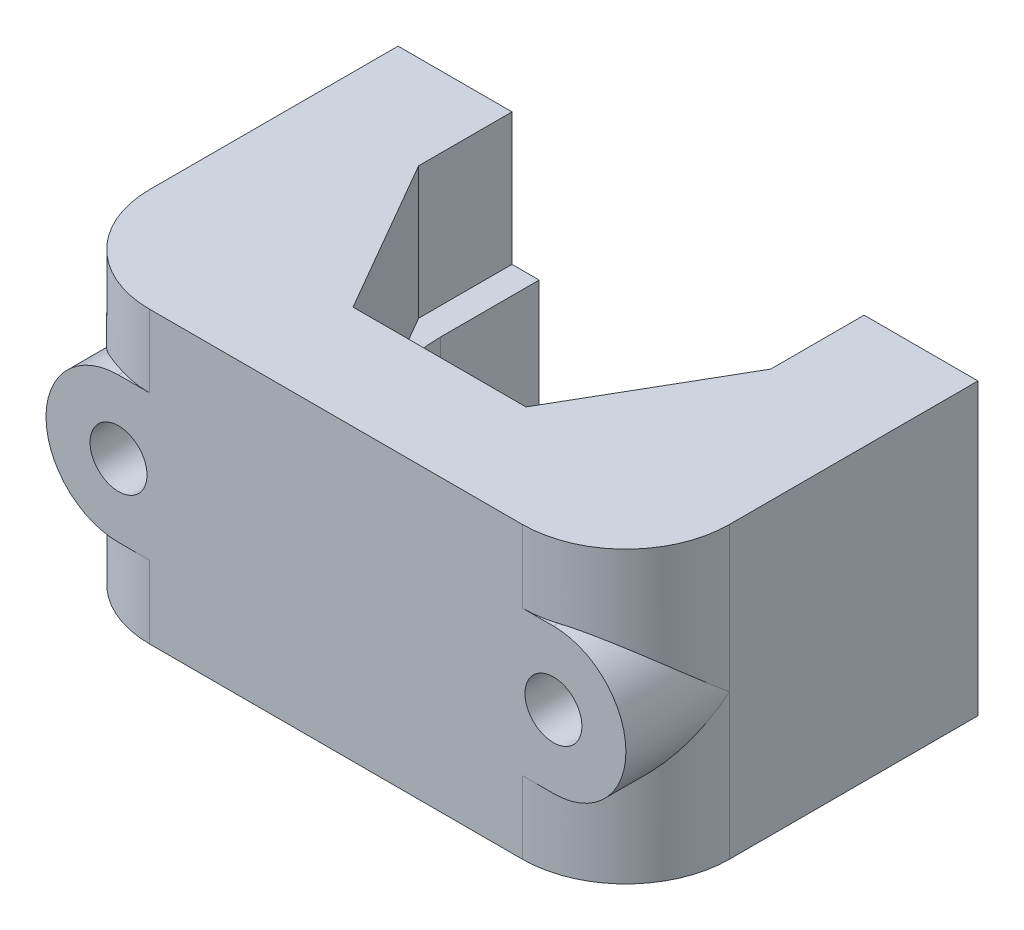
ISO-10303-21;
HEADER;
FILE_DESCRIPTION(('STEP AP214'),'2;1');
FILE_NAME('part.step','',(''),(''),'','','');
FILE_SCHEMA(('AUTOMOTIVE_DESIGN { 1 0 10303 214 1 1 1 1 }'));
ENDSEC;
DATA;
#1=APPLICATION_CONTEXT('core data for automotive mechanical design processes');
#2=APPLICATION_PROTOCOL_DEFINITION('international standard','automotive_design',2000,#1);
#3=PRODUCT_CONTEXT('',#1,'mechanical');
#4=PRODUCT('Part','Part','',(#3));
#5=PRODUCT_RELATED_PRODUCT_CATEGORY('part','',(#4));
#6=PRODUCT_DEFINITION_FORMATION('','',#4);
#7=PRODUCT_DEFINITION_CONTEXT('part definition',#1,'design');
#8=PRODUCT_DEFINITION('design','',#6,#7);
#9=PRODUCT_DEFINITION_SHAPE('','',#8);
#10=(LENGTH_UNIT() NAMED_UNIT(*) SI_UNIT(.MILLI.,.METRE.));
#11=(NAMED_UNIT(*) PLANE_ANGLE_UNIT() SI_UNIT($,.RADIAN.));
#12=(NAMED_UNIT(*) SI_UNIT($,.STERADIAN.) SOLID_ANGLE_UNIT());
#13=UNCERTAINTY_MEASURE_WITH_UNIT(LENGTH_MEASURE(1.E-05),#10,'distance_accuracy_value','');
#14=(GEOMETRIC_REPRESENTATION_CONTEXT(3) GLOBAL_UNCERTAINTY_ASSIGNED_CONTEXT((#13)) GLOBAL_UNIT_ASSIGNED_CONTEXT((#10,
#11,#12)) REPRESENTATION_CONTEXT('',''));
#15=CARTESIAN_POINT('',(0.,0.,0.));
#16=DIRECTION('',(0.,0.,1.));
#17=DIRECTION('',(1.,0.,0.));
#18=AXIS2_PLACEMENT_3D('',#15,#16,#17);
#19=CARTESIAN_POINT('',(18.,28.,7.));
#20=DIRECTION('',(0.,-1.,0.));
#21=DIRECTION('',(0.,0.,-1.));
#22=AXIS2_PLACEMENT_3D('',#19,#20,#21);
#23=CYLINDRICAL_SURFACE('',#22,10.);
#24=CARTESIAN_POINT('',(18.,7.,7.));
#25=DIRECTION('',(0.,-1.,0.));
#26=DIRECTION('',(1.,0.,0.));
#27=AXIS2_PLACEMENT_3D('',#24,#25,#26);
#28=CIRCLE('',#27,10.);
#29=CARTESIAN_POINT('',(18.,7.,17.));
#30=VERTEX_POINT('',#29);
#31=CARTESIAN_POINT('',(21.,7.,16.5393920141695));
#32=VERTEX_POINT('',#31);
#33=EDGE_CURVE('E11',#30,#32,#28,.F.);
#34=ORIENTED_EDGE('',*,*,#33,.F.);
#35=DIRECTION('',(0.,-1.,0.));
#36=VECTOR('',#35,1.);
#37=CARTESIAN_POINT('',(18.,28.,17.));
#38=LINE('',#37,#36);
#39=CARTESIAN_POINT('',(18.,0.,17.));
#40=VERTEX_POINT('',#39);
#41=EDGE_CURVE('E336',#40,#30,#38,.F.);
#42=ORIENTED_EDGE('',*,*,#41,.F.);
#43=CARTESIAN_POINT('',(18.,0.,7.));
#44=DIRECTION('',(0.,-1.,0.));
#45=DIRECTION('',(0.,0.,-1.));
#46=AXIS2_PLACEMENT_3D('',#43,#44,#45);
#47=CIRCLE('',#46,10.);
#48=CARTESIAN_POINT('',(28.,0.,7.));
#49=VERTEX_POINT('',#48);
#50=EDGE_CURVE('E329',#49,#40,#47,.T.);
#51=ORIENTED_EDGE('',*,*,#50,.F.);
#52=DIRECTION('',(0.,-1.,0.));
#53=VECTOR('',#52,1.);
#54=CARTESIAN_POINT('',(28.,28.,7.));
#55=LINE('',#54,#53);
#56=CARTESIAN_POINT('',(28.,14.,7.));
#57=VERTEX_POINT('',#56);
#58=EDGE_CURVE('E323',#57,#49,#55,.T.);
#59=ORIENTED_EDGE('',*,*,#58,.F.);
#60=CARTESIAN_POINT('',(18.,7.67544467966324,17.));
#61=CARTESIAN_POINT('',(18.151591670897,7.60350463316133,17.0000275659047));
#62=CARTESIAN_POINT('',(18.3058134289684,7.53706094359077,16.9965539811801));
#63=CARTESIAN_POINT('',(18.6183277419677,7.41550033736447,16.982083687537));
#64=CARTESIAN_POINT('',(18.7766206650396,7.36038444913038,16.9710862959435));
#65=CARTESIAN_POINT('',(19.0955114974498,7.26199591021074,16.9410989491163));
#66=CARTESIAN_POINT('',(19.2560996246948,7.21868323937458,16.9221365703262));
#67=CARTESIAN_POINT('',(19.5787962164307,7.14379075090905,16.8759281223142));
#68=CARTESIAN_POINT('',(19.7409045388676,7.11220984799179,16.8486828197571));
#69=CARTESIAN_POINT('',(20.0655355259705,7.06070460024447,16.7857515768893));
#70=CARTESIAN_POINT('',(20.2280584539619,7.0407940998188,16.7500556819373));
#71=CARTESIAN_POINT('',(20.5520552788346,7.01245439683495,16.6703076695015));
#72=CARTESIAN_POINT('',(20.7135291056568,7.00402595336219,16.6262549997657));
#73=CARTESIAN_POINT('',(21.0342322989839,6.99824652781946,16.530029578288));
#74=CARTESIAN_POINT('',(21.1934616306042,7.00089571773075,16.4778567004913));
#75=CARTESIAN_POINT('',(21.5086223174119,7.01671971702876,16.3657647867368));
#76=CARTESIAN_POINT('',(21.6645536346693,7.02989464740265,16.3058456617472));
#77=CARTESIAN_POINT('',(21.9746984827905,7.06640589951094,16.1777101072773));
#78=CARTESIAN_POINT('',(22.1288447583472,7.08990121615074,16.1093764007993));
#79=CARTESIAN_POINT('',(22.4321039391893,7.14632234754203,15.9657489772278));
#80=CARTESIAN_POINT('',(22.5812150162124,7.1792515474053,15.890452768395));
#81=CARTESIAN_POINT('',(23.0201926323534,7.29105655533448,15.6549264804796));
#82=CARTESIAN_POINT('',(23.3017312051195,7.38295326749079,15.4850472118168));
#83=CARTESIAN_POINT('',(23.7728408138076,7.56891616067594,15.1690837991766));
#84=CARTESIAN_POINT('',(23.967971102265,7.6568598371597,15.0274613032776));
#85=CARTESIAN_POINT('',(24.3435200983199,7.84653747255893,14.7341117265996));
#86=CARTESIAN_POINT('',(24.5239329308558,7.94827689587169,14.5823806540608));
#87=CARTESIAN_POINT('',(24.8701182050998,8.16357741193527,14.2702081587616));
#88=CARTESIAN_POINT('',(25.0358649155686,8.27715854902385,14.1097521944772));
#89=CARTESIAN_POINT('',(25.3525542617819,8.51416518188523,13.7817341758596));
#90=CARTESIAN_POINT('',(25.5034968157868,8.63759073200611,13.6141720822981));
#91=CARTESIAN_POINT('',(25.8473751281613,8.94286500335221,13.2060623467399));
#92=CARTESIAN_POINT('',(26.0335191032786,9.12862004414769,12.9626975378819));
#93=CARTESIAN_POINT('',(26.3787930189989,9.51276059785996,12.4669136033241));
#94=CARTESIAN_POINT('',(26.5379120053906,9.71115118783701,12.2144908560885));
#95=CARTESIAN_POINT('',(26.8303365332226,10.1179905201692,11.702360599615));
#96=CARTESIAN_POINT('',(26.9636109450841,10.3264510189371,11.4426447314515));
#97=CARTESIAN_POINT('',(27.2050769826474,10.7509025133519,10.9179042328043));
#98=CARTESIAN_POINT('',(27.3132719926699,10.9668924884087,10.65288032386));
#99=CARTESIAN_POINT('',(27.5085829875087,11.4117113933119,10.1100967537544));
#100=CARTESIAN_POINT('',(27.5948976372845,11.6407293639308,9.83220343060461));
#101=CARTESIAN_POINT('',(27.7424370656255,12.1030395527597,9.2734294004811));
#102=CARTESIAN_POINT('',(27.8036577953,12.3363324543885,8.99254821891298));
#103=CARTESIAN_POINT('',(27.9502499186836,13.0393865601193,8.14816027008462));
#104=CARTESIAN_POINT('',(27.9991205078775,13.5136528743621,7.5812960655684));
#105=CARTESIAN_POINT('',(27.9999960748293,13.9914442111166,7.01022612498551));
#106=CARTESIAN_POINT('',(27.9999999962139,13.9957221387849,7.00511302347019));
#107=CARTESIAN_POINT('',(28.,14.,6.99999999999999));
#108=B_SPLINE_CURVE_WITH_KNOTS('',3,(#60,#61,#62,#63,#64,#65,#66,#67,#68,#69,#70,#71,#72,#73,
#74,#75,#76,#77,#78,#79,#80,#81,#82,#83,#84,#85,#86,#87,#88,#89,#90,#91,#92,#93,#94,#95,#96,#97,
#98,#99,#100,#101,#102,#103,#104,#105,#106,#107),.UNSPECIFIED.,.F.,.F.,(4,2,2,2,2,2,2,2,2,2,2,2,
2,2,2,2,2,2,2,2,2,2,2,4),(0.,0.503271269304962,1.00658820913766,1.50817674020264,
2.00971885851898,2.51185475002133,3.01402383640688,3.51620071904199,4.01838337398713,
4.52858988832062,5.03897970722538,6.05966971402223,6.82867623977674,7.59798825818142,
8.3686243015096,9.13926459958357,10.2125873454532,11.2863441151418,12.3613862904773,
13.4362833105044,14.546190391155,15.6562764842976,17.8699961332932,17.8899961367534),.UNSPECIFIED.);
#109=EDGE_CURVE('E41',#32,#57,#108,.T.);
#110=ORIENTED_EDGE('',*,*,#109,.F.);
#111=EDGE_LOOP('',(#34,#42,#51,#59,#110));
#112=FACE_BOUND('',#111,.T.);
#113=ADVANCED_FACE('F32',(#112),#23,.T.);
#114=CARTESIAN_POINT('',(-18.,28.,7.));
#115=DIRECTION('',(0.,-1.,0.));
#116=DIRECTION('',(0.,0.,-1.));
#117=AXIS2_PLACEMENT_3D('',#114,#115,#116);
#118=CYLINDRICAL_SURFACE('',#117,10.);
#119=CARTESIAN_POINT('',(-18.,21.,7.));
#120=DIRECTION('',(0.,1.,0.));
#121=DIRECTION('',(-1.,0.,0.));
#122=AXIS2_PLACEMENT_3D('',#119,#120,#121);
#123=CIRCLE('',#122,10.);
#124=CARTESIAN_POINT('',(-18.,21.,17.));
#125=VERTEX_POINT('',#124);
#126=CARTESIAN_POINT('',(-21.,21.,16.5393920141695));
#127=VERTEX_POINT('',#126);
#128=EDGE_CURVE('E492',#125,#127,#123,.F.);
#129=ORIENTED_EDGE('',*,*,#128,.F.);
#130=DIRECTION('',(0.,-1.,0.));
#131=VECTOR('',#130,1.);
#132=CARTESIAN_POINT('',(-18.,28.,17.));
#133=LINE('',#132,#131);
#134=CARTESIAN_POINT('',(-18.,28.,17.));
#135=VERTEX_POINT('',#134);
#136=EDGE_CURVE('E332',#135,#125,#133,.T.);
#137=ORIENTED_EDGE('',*,*,#136,.F.);
#138=CARTESIAN_POINT('',(-18.,28.,7.));
#139=DIRECTION('',(0.,-1.,0.));
#140=DIRECTION('',(0.,0.,-1.));
#141=AXIS2_PLACEMENT_3D('',#138,#139,#140);
#142=CIRCLE('',#141,10.);
#143=CARTESIAN_POINT('',(-28.,28.,7.));
#144=VERTEX_POINT('',#143);
#145=EDGE_CURVE('E338',#144,#135,#142,.F.);
#146=ORIENTED_EDGE('',*,*,#145,.F.);
#147=DIRECTION('',(0.,-1.,0.));
#148=VECTOR('',#147,1.);
#149=CARTESIAN_POINT('',(-28.,28.,7.));
#150=LINE('',#149,#148);
#151=CARTESIAN_POINT('',(-28.,14.,7.));
#152=VERTEX_POINT('',#151);
#153=EDGE_CURVE('E342',#152,#144,#150,.F.);
#154=ORIENTED_EDGE('',*,*,#153,.F.);
#155=CARTESIAN_POINT('',(-18.,20.3245553203368,17.));
#156=CARTESIAN_POINT('',(-18.151591670897,20.3964953668387,17.0000275659047));
#157=CARTESIAN_POINT('',(-18.3058134289684,20.4629390564092,16.9965539811801));
#158=CARTESIAN_POINT('',(-18.6183277419678,20.5844996626356,16.982083687537));
#159=CARTESIAN_POINT('',(-18.7766206650397,20.6396155508696,16.9710862959435));
#160=CARTESIAN_POINT('',(-19.0955114974499,20.7380040897893,16.9410989491163));
#161=CARTESIAN_POINT('',(-19.2560996246948,20.7813167606254,16.9221365703262));
#162=CARTESIAN_POINT('',(-19.5787962164307,20.856209249091,16.8759281223141));
#163=CARTESIAN_POINT('',(-19.7409045388677,20.8877901520082,16.8486828197571));
#164=CARTESIAN_POINT('',(-20.0655355259705,20.9392953997555,16.7857515768893));
#165=CARTESIAN_POINT('',(-20.2280584539619,20.9592059001812,16.7500556819373));
#166=CARTESIAN_POINT('',(-20.5520552788345,20.987545603165,16.6703076695015));
#167=CARTESIAN_POINT('',(-20.7135291056568,20.9959740466378,16.6262549997657));
#168=CARTESIAN_POINT('',(-21.0342322989838,21.0017534721805,16.530029578288));
#169=CARTESIAN_POINT('',(-21.1934616306042,20.9991042822693,16.4778567004913));
#170=CARTESIAN_POINT('',(-21.5086223174119,20.9832802829712,16.3657647867369));
#171=CARTESIAN_POINT('',(-21.6645536346693,20.9701053525974,16.3058456617472));
#172=CARTESIAN_POINT('',(-21.9746984827905,20.9335941004891,16.1777101072773));
#173=CARTESIAN_POINT('',(-22.1288447583472,20.9100987838493,16.1093764007993));
#174=CARTESIAN_POINT('',(-22.4321039391894,20.853677652458,15.9657489772278));
#175=CARTESIAN_POINT('',(-22.5812150162125,20.8207484525947,15.890452768395));
#176=CARTESIAN_POINT('',(-23.0201926323534,20.7089434446655,15.6549264804795));
#177=CARTESIAN_POINT('',(-23.3017312051195,20.6170467325092,15.4850472118168));
#178=CARTESIAN_POINT('',(-23.7728408138076,20.4310838393241,15.1690837991766));
#179=CARTESIAN_POINT('',(-23.967971102265,20.3431401628403,15.0274613032776));
#180=CARTESIAN_POINT('',(-24.3435200983197,20.1534625274411,14.7341117265997));
#181=CARTESIAN_POINT('',(-24.5239329308557,20.0517231041284,14.582380654061));
#182=CARTESIAN_POINT('',(-24.8701182050996,19.8364225880648,14.2702081587617));
#183=CARTESIAN_POINT('',(-25.0358649155685,19.7228414509763,14.1097521944773));
#184=CARTESIAN_POINT('',(-25.3525542617818,19.4858348181148,13.7817341758597));
#185=CARTESIAN_POINT('',(-25.5034968157867,19.3624092679939,13.6141720822981));
#186=CARTESIAN_POINT('',(-25.8473751281614,19.0571349966477,13.2060623467398));
#187=CARTESIAN_POINT('',(-26.0335191032787,18.8713799558522,12.9626975378817));
#188=CARTESIAN_POINT('',(-26.3787930189991,18.4872394021398,12.4669136033238));
#189=CARTESIAN_POINT('',(-26.5379120053909,18.2888488121627,12.214490856088));
#190=CARTESIAN_POINT('',(-26.8303365332228,17.8820094798304,11.7023605996146));
#191=CARTESIAN_POINT('',(-26.9636109450843,17.6735489810624,11.4426447314514));
#192=CARTESIAN_POINT('',(-27.2050769826475,17.2490974866482,10.917904232804));
#193=CARTESIAN_POINT('',(-27.3132719926699,17.0331075115919,10.6528803238594));
#194=CARTESIAN_POINT('',(-27.5085829875087,16.5882886066875,10.1100967537549));
#195=CARTESIAN_POINT('',(-27.5948976372845,16.3592706360667,9.83220343060675));
#196=CARTESIAN_POINT('',(-27.7424370656255,15.8969604472429,9.27342940047912));
#197=CARTESIAN_POINT('',(-27.8036577953,15.6636675456209,8.99254821890534));
#198=CARTESIAN_POINT('',(-27.9502499186835,14.9606134398621,8.14816027010043));
#199=CARTESIAN_POINT('',(-27.9991205078774,14.486347125536,7.58129606565374));
#200=CARTESIAN_POINT('',(-27.9999960748293,14.0085557888816,7.01022612498705));
#201=CARTESIAN_POINT('',(-27.9999999962139,14.0042778612142,7.00511302347097));
#202=CARTESIAN_POINT('',(-28.,14.,6.99999999999999));
#203=B_SPLINE_CURVE_WITH_KNOTS('',3,(#155,#156,#157,#158,#159,#160,#161,#162,#163,#164,#165,
#166,#167,#168,#169,#170,#171,#172,#173,#174,#175,#176,#177,#178,#179,#180,#181,#182,#183,#184,
#185,#186,#187,#188,#189,#190,#191,#192,#193,#194,#195,#196,#197,#198,#199,#200,#201,#202),
.UNSPECIFIED.,.F.,.F.,(4,2,2,2,2,2,2,2,2,2,2,2,2,2,2,2,2,2,2,2,2,2,2,4),(0.,0.503271269304999,
1.00658820913773,1.50817674020267,2.00971885851899,2.51185475002131,3.01402383640683,
3.51620071904196,4.01838337398713,4.52858988832067,5.03897970722547,6.05966971402223,
6.82867623977658,7.59798825818109,8.36862430150943,9.13926459958357,10.2125873454536,
11.2863441151426,12.3613862904776,13.4362833105044,14.546190391155,15.6562764842973,
17.8699961332932,17.8899961367534),.UNSPECIFIED.);
#204=EDGE_CURVE('E355',#127,#152,#203,.T.);
#205=ORIENTED_EDGE('',*,*,#204,.F.);
#206=EDGE_LOOP('',(#129,#137,#146,#154,#205));
#207=FACE_BOUND('',#206,.T.);
#208=ADVANCED_FACE('F471',(#207),#118,.T.);
#209=CARTESIAN_POINT('',(-28.,28.,-17.));
#210=DIRECTION('',(0.,0.,1.));
#211=DIRECTION('',(1.,0.,0.));
#212=AXIS2_PLACEMENT_3D('',#209,#210,#211);
#213=PLANE('',#212);
#214=CARTESIAN_POINT('',(21.,14.,-17.));
#215=DIRECTION('',(0.,0.,1.));
#216=DIRECTION('',(1.,0.,0.));
#217=AXIS2_PLACEMENT_3D('',#214,#215,#216);
#218=CIRCLE('',#217,2.75);
#219=CARTESIAN_POINT('',(23.75,14.,-17.));
#220=VERTEX_POINT('',#219);
#221=EDGE_CURVE('E538',#220,#220,#218,.F.);
#222=ORIENTED_EDGE('',*,*,#221,.F.);
#223=EDGE_LOOP('',(#222));
#224=FACE_BOUND('',#223,.T.);
#225=DIRECTION('',(-1.,0.,0.));
#226=VECTOR('',#225,1.);
#227=CARTESIAN_POINT('',(-28.,0.,-17.));
#228=LINE('',#227,#226);
#229=CARTESIAN_POINT('',(28.,0.,-17.));
#230=VERTEX_POINT('',#229);
#231=CARTESIAN_POINT('',(14.375,0.,-17.));
#232=VERTEX_POINT('',#231);
#233=EDGE_CURVE('E311',#230,#232,#228,.T.);
#234=ORIENTED_EDGE('',*,*,#233,.T.);
#235=DIRECTION('',(0.,1.,0.));
#236=VECTOR('',#235,1.);
#237=CARTESIAN_POINT('',(14.375,-37.3947083734369,-17.));
#238=LINE('',#237,#236);
#239=CARTESIAN_POINT('',(14.375,15.25,-17.));
#240=VERTEX_POINT('',#239);
#241=EDGE_CURVE('E232',#232,#240,#238,.T.);
#242=ORIENTED_EDGE('',*,*,#241,.T.);
#243=DIRECTION('',(-1.,0.,0.));
#244=VECTOR('',#243,1.);
#245=CARTESIAN_POINT('',(-17.,15.25,-17.));
#246=LINE('',#245,#244);
#247=CARTESIAN_POINT('',(17.,15.25,-17.));
#248=VERTEX_POINT('',#247);
#249=EDGE_CURVE('E266',#248,#240,#246,.T.);
#250=ORIENTED_EDGE('',*,*,#249,.F.);
#251=DIRECTION('',(0.,1.,0.));
#252=VECTOR('',#251,1.);
#253=CARTESIAN_POINT('',(17.,15.25,-17.));
#254=LINE('',#253,#252);
#255=CARTESIAN_POINT('',(17.,28.,-17.));
#256=VERTEX_POINT('',#255);
#257=EDGE_CURVE('E284',#248,#256,#254,.T.);
#258=ORIENTED_EDGE('',*,*,#257,.T.);
#259=DIRECTION('',(-1.,0.,0.));
#260=VECTOR('',#259,1.);
#261=CARTESIAN_POINT('',(-28.,28.,-17.));
#262=LINE('',#261,#260);
#263=CARTESIAN_POINT('',(28.,28.,-17.));
#264=VERTEX_POINT('',#263);
#265=EDGE_CURVE('E299',#264,#256,#262,.T.);
#266=ORIENTED_EDGE('',*,*,#265,.F.);
#267=DIRECTION('',(0.,-1.,0.));
#268=VECTOR('',#267,1.);
#269=CARTESIAN_POINT('',(28.,28.,-17.));
#270=LINE('',#269,#268);
#271=EDGE_CURVE('E320',#264,#230,#270,.T.);
#272=ORIENTED_EDGE('',*,*,#271,.T.);
#273=EDGE_LOOP('',(#234,#242,#250,#258,#266,#272));
#274=FACE_BOUND('',#273,.T.);
#275=ADVANCED_FACE('F435',(#224,#274),#213,.F.);
#276=CARTESIAN_POINT('',(28.,28.,17.));
#277=DIRECTION('',(-1.,0.,0.));
#278=DIRECTION('',(0.,0.,1.));
#279=AXIS2_PLACEMENT_3D('',#276,#277,#278);
#280=PLANE('',#279);
#281=DIRECTION('',(0.,0.,-1.));
#282=VECTOR('',#281,1.);
#283=CARTESIAN_POINT('',(28.,28.,17.));
#284=LINE('',#283,#282);
#285=CARTESIAN_POINT('',(28.,28.,7.));
#286=VERTEX_POINT('',#285);
#287=EDGE_CURVE('E295',#286,#264,#284,.T.);
#288=ORIENTED_EDGE('',*,*,#287,.F.);
#289=EDGE_CURVE('E324',#286,#57,#55,.T.);
#290=ORIENTED_EDGE('',*,*,#289,.T.);
#291=ORIENTED_EDGE('',*,*,#58,.T.);
#292=DIRECTION('',(0.,0.,-1.));
#293=VECTOR('',#292,1.);
#294=CARTESIAN_POINT('',(28.,0.,17.));
#295=LINE('',#294,#293);
#296=EDGE_CURVE('E283',#49,#230,#295,.T.);
#297=ORIENTED_EDGE('',*,*,#296,.T.);
#298=ORIENTED_EDGE('',*,*,#271,.F.);
#299=EDGE_LOOP('',(#288,#290,#291,#297,#298));
#300=FACE_BOUND('',#299,.T.);
#301=ADVANCED_FACE('F433',(#300),#280,.F.);
#302=CARTESIAN_POINT('',(-21.,14.,-17.));
#303=DIRECTION('',(0.,0.,1.));
#304=DIRECTION('',(1.,0.,0.));
#305=AXIS2_PLACEMENT_3D('',#302,#303,#304);
#306=CIRCLE('',#305,2.75);
#307=CARTESIAN_POINT('',(-18.25,14.,-17.));
#308=VERTEX_POINT('',#307);
#309=EDGE_CURVE('E202',#308,#308,#306,.F.);
#310=ORIENTED_EDGE('',*,*,#309,.F.);
#311=EDGE_LOOP('',(#310));
#312=FACE_BOUND('',#311,.T.);
#313=CARTESIAN_POINT('',(-14.375,15.25,-17.));
#314=VERTEX_POINT('',#313);
#315=CARTESIAN_POINT('',(-17.,15.25,-17.));
#316=VERTEX_POINT('',#315);
#317=EDGE_CURVE('E265',#314,#316,#246,.T.);
#318=ORIENTED_EDGE('',*,*,#317,.F.);
#319=DIRECTION('',(0.,1.,0.));
#320=VECTOR('',#319,1.);
#321=CARTESIAN_POINT('',(-14.375,-37.3947083734369,-17.));
#322=LINE('',#321,#320);
#323=CARTESIAN_POINT('',(-14.375,0.,-17.));
#324=VERTEX_POINT('',#323);
#325=EDGE_CURVE('E241',#324,#314,#322,.T.);
#326=ORIENTED_EDGE('',*,*,#325,.F.);
#327=CARTESIAN_POINT('',(-28.,0.,-17.));
#328=VERTEX_POINT('',#327);
#329=EDGE_CURVE('E310',#324,#328,#228,.T.);
#330=ORIENTED_EDGE('',*,*,#329,.T.);
#331=DIRECTION('',(0.,-1.,0.));
#332=VECTOR('',#331,1.);
#333=CARTESIAN_POINT('',(-28.,28.,-17.));
#334=LINE('',#333,#332);
#335=CARTESIAN_POINT('',(-28.,28.,-17.));
#336=VERTEX_POINT('',#335);
#337=EDGE_CURVE('E308',#336,#328,#334,.T.);
#338=ORIENTED_EDGE('',*,*,#337,.F.);
#339=CARTESIAN_POINT('',(-17.,28.,-17.));
#340=VERTEX_POINT('',#339);
#341=EDGE_CURVE('E297',#340,#336,#262,.T.);
#342=ORIENTED_EDGE('',*,*,#341,.F.);
#343=DIRECTION('',(0.,1.,0.));
#344=VECTOR('',#343,1.);
#345=CARTESIAN_POINT('',(-17.,15.25,-17.));
#346=LINE('',#345,#344);
#347=EDGE_CURVE('E281',#316,#340,#346,.T.);
#348=ORIENTED_EDGE('',*,*,#347,.F.);
#349=EDGE_LOOP('',(#318,#326,#330,#338,#342,#348));
#350=FACE_BOUND('',#349,.T.);
#351=ADVANCED_FACE('F429',(#312,#350),#213,.F.);
#352=CARTESIAN_POINT('',(-28.,28.,17.));
#353=DIRECTION('',(1.,0.,0.));
#354=DIRECTION('',(0.,0.,-1.));
#355=AXIS2_PLACEMENT_3D('',#352,#353,#354);
#356=PLANE('',#355);
#357=DIRECTION('',(0.,0.,1.));
#358=VECTOR('',#357,1.);
#359=CARTESIAN_POINT('',(-28.,0.,17.));
#360=LINE('',#359,#358);
#361=CARTESIAN_POINT('',(-28.,0.,7.));
#362=VERTEX_POINT('',#361);
#363=EDGE_CURVE('E314',#328,#362,#360,.T.);
#364=ORIENTED_EDGE('',*,*,#363,.T.);
#365=EDGE_CURVE('E343',#362,#152,#150,.F.);
#366=ORIENTED_EDGE('',*,*,#365,.T.);
#367=ORIENTED_EDGE('',*,*,#153,.T.);
#368=DIRECTION('',(0.,0.,1.));
#369=VECTOR('',#368,1.);
#370=CARTESIAN_POINT('',(-28.,28.,17.));
#371=LINE('',#370,#369);
#372=EDGE_CURVE('E302',#336,#144,#371,.T.);
#373=ORIENTED_EDGE('',*,*,#372,.F.);
#374=ORIENTED_EDGE('',*,*,#337,.T.);
#375=EDGE_LOOP('',(#364,#366,#367,#373,#374));
#376=FACE_BOUND('',#375,.T.);
#377=ADVANCED_FACE('F425',(#376),#356,.F.);
#378=CARTESIAN_POINT('',(-28.,28.,17.));
#379=DIRECTION('',(0.,0.,-1.));
#380=DIRECTION('',(-1.,0.,0.));
#381=AXIS2_PLACEMENT_3D('',#378,#379,#380);
#382=PLANE('',#381);
#383=CARTESIAN_POINT('',(-21.,14.,17.));
#384=DIRECTION('',(0.,0.,1.));
#385=DIRECTION('',(1.,0.,0.));
#386=AXIS2_PLACEMENT_3D('',#383,#384,#385);
#387=CIRCLE('',#386,2.75);
#388=CARTESIAN_POINT('',(-18.25,14.,17.));
#389=VERTEX_POINT('',#388);
#390=EDGE_CURVE('E539',#389,#389,#387,.T.);
#391=ORIENTED_EDGE('',*,*,#390,.F.);
#392=EDGE_LOOP('',(#391));
#393=FACE_BOUND('',#392,.T.);
#394=CARTESIAN_POINT('',(21.,14.,17.));
#395=DIRECTION('',(0.,0.,1.));
#396=DIRECTION('',(1.,0.,0.));
#397=AXIS2_PLACEMENT_3D('',#394,#395,#396);
#398=CIRCLE('',#397,2.75);
#399=CARTESIAN_POINT('',(23.75,14.,17.));
#400=VERTEX_POINT('',#399);
#401=EDGE_CURVE('E540',#400,#400,#398,.T.);
#402=ORIENTED_EDGE('',*,*,#401,.F.);
#403=EDGE_LOOP('',(#402));
#404=FACE_BOUND('',#403,.T.);
#405=DIRECTION('',(1.,0.,0.));
#406=VECTOR('',#405,1.);
#407=CARTESIAN_POINT('',(-28.,0.,17.));
#408=LINE('',#407,#406);
#409=CARTESIAN_POINT('',(-18.,0.,17.));
#410=VERTEX_POINT('',#409);
#411=EDGE_CURVE('E298',#410,#40,#408,.T.);
#412=ORIENTED_EDGE('',*,*,#411,.T.);
#413=ORIENTED_EDGE('',*,*,#41,.T.);
#414=DIRECTION('',(1.,0.,0.));
#415=VECTOR('',#414,1.);
#416=CARTESIAN_POINT('',(18.,7.,17.));
#417=LINE('',#416,#415);
#418=CARTESIAN_POINT('',(21.,7.,17.));
#419=VERTEX_POINT('',#418);
#420=EDGE_CURVE('E189',#30,#419,#417,.T.);
#421=ORIENTED_EDGE('',*,*,#420,.T.);
#422=CARTESIAN_POINT('',(21.,14.,17.));
#423=DIRECTION('',(0.,0.,-1.));
#424=DIRECTION('',(-1.,0.,0.));
#425=AXIS2_PLACEMENT_3D('',#422,#423,#424);
#426=CIRCLE('',#425,7.);
#427=CARTESIAN_POINT('',(21.,21.,17.));
#428=VERTEX_POINT('',#427);
#429=EDGE_CURVE('E184',#419,#428,#426,.F.);
#430=ORIENTED_EDGE('',*,*,#429,.T.);
#431=DIRECTION('',(-1.,0.,0.));
#432=VECTOR('',#431,1.);
#433=CARTESIAN_POINT('',(18.,21.,17.));
#434=LINE('',#433,#432);
#435=CARTESIAN_POINT('',(18.,21.,17.));
#436=VERTEX_POINT('',#435);
#437=EDGE_CURVE('E48',#428,#436,#434,.T.);
#438=ORIENTED_EDGE('',*,*,#437,.T.);
#439=CARTESIAN_POINT('',(18.,28.,17.));
#440=VERTEX_POINT('',#439);
#441=EDGE_CURVE('E335',#436,#440,#38,.F.);
#442=ORIENTED_EDGE('',*,*,#441,.T.);
#443=DIRECTION('',(1.,0.,0.));
#444=VECTOR('',#443,1.);
#445=CARTESIAN_POINT('',(-28.,28.,17.));
#446=LINE('',#445,#444);
#447=EDGE_CURVE('E305',#135,#440,#446,.T.);
#448=ORIENTED_EDGE('',*,*,#447,.F.);
#449=ORIENTED_EDGE('',*,*,#136,.T.);
#450=DIRECTION('',(-1.,0.,0.));
#451=VECTOR('',#450,1.);
#452=CARTESIAN_POINT('',(-18.,21.,17.));
#453=LINE('',#452,#451);
#454=CARTESIAN_POINT('',(-21.,21.,17.));
#455=VERTEX_POINT('',#454);
#456=EDGE_CURVE('E218',#125,#455,#453,.T.);
#457=ORIENTED_EDGE('',*,*,#456,.T.);
#458=CARTESIAN_POINT('',(-21.,14.,17.));
#459=DIRECTION('',(0.,0.,-1.));
#460=DIRECTION('',(-1.,0.,0.));
#461=AXIS2_PLACEMENT_3D('',#458,#459,#460);
#462=CIRCLE('',#461,7.);
#463=CARTESIAN_POINT('',(-21.,7.,17.));
#464=VERTEX_POINT('',#463);
#465=EDGE_CURVE('E216',#455,#464,#462,.F.);
#466=ORIENTED_EDGE('',*,*,#465,.T.);
#467=DIRECTION('',(1.,0.,0.));
#468=VECTOR('',#467,1.);
#469=CARTESIAN_POINT('',(-18.,7.,17.));
#470=LINE('',#469,#468);
#471=CARTESIAN_POINT('',(-18.,7.,17.));
#472=VERTEX_POINT('',#471);
#473=EDGE_CURVE('E55',#464,#472,#470,.T.);
#474=ORIENTED_EDGE('',*,*,#473,.T.);
#475=EDGE_CURVE('E331',#472,#410,#133,.T.);
#476=ORIENTED_EDGE('',*,*,#475,.T.);
#477=EDGE_LOOP('',(#412,#413,#421,#430,#438,#442,#448,#449,#457,#466,#474,#476));
#478=FACE_BOUND('',#477,.T.);
#479=ADVANCED_FACE('F187',(#393,#404,#478),#382,.F.);
#480=CARTESIAN_POINT('',(0.,28.,0.));
#481=DIRECTION('',(0.,-1.,0.));
#482=DIRECTION('',(0.,0.,-1.));
#483=AXIS2_PLACEMENT_3D('',#480,#481,#482);
#484=PLANE('',#483);
#485=ORIENTED_EDGE('',*,*,#447,.T.);
#486=CARTESIAN_POINT('',(18.,28.,7.));
#487=DIRECTION('',(0.,-1.,0.));
#488=DIRECTION('',(0.,0.,-1.));
#489=AXIS2_PLACEMENT_3D('',#486,#487,#488);
#490=CIRCLE('',#489,10.);
#491=EDGE_CURVE('E340',#440,#286,#490,.F.);
#492=ORIENTED_EDGE('',*,*,#491,.T.);
#493=ORIENTED_EDGE('',*,*,#287,.T.);
#494=ORIENTED_EDGE('',*,*,#265,.T.);
#495=DIRECTION('',(0.,0.,-1.));
#496=VECTOR('',#495,1.);
#497=CARTESIAN_POINT('',(17.,28.,-7.98223948547079));
#498=LINE('',#497,#496);
#499=CARTESIAN_POINT('',(17.,28.,-7.98223948547079));
#500=VERTEX_POINT('',#499);
#501=EDGE_CURVE('E253',#500,#256,#498,.T.);
#502=ORIENTED_EDGE('',*,*,#501,.F.);
#503=DIRECTION('',(0.5,0.,-0.866025403784439));
#504=VECTOR('',#503,1.);
#505=CARTESIAN_POINT('',(8.34999999999998,28.,7.));
#506=LINE('',#505,#504);
#507=CARTESIAN_POINT('',(8.34999999999998,28.,7.));
#508=VERTEX_POINT('',#507);
#509=EDGE_CURVE('E277',#508,#500,#506,.T.);
#510=ORIENTED_EDGE('',*,*,#509,.F.);
#511=DIRECTION('',(1.,0.,0.));
#512=VECTOR('',#511,1.);
#513=CARTESIAN_POINT('',(-8.35000000000001,28.,7.));
#514=LINE('',#513,#512);
#515=CARTESIAN_POINT('',(-8.35000000000001,28.,7.));
#516=VERTEX_POINT('',#515);
#517=EDGE_CURVE('E274',#516,#508,#514,.T.);
#518=ORIENTED_EDGE('',*,*,#517,.F.);
#519=DIRECTION('',(0.5,0.,0.866025403784439));
#520=VECTOR('',#519,1.);
#521=CARTESIAN_POINT('',(-17.,28.,-7.98223948547079));
#522=LINE('',#521,#520);
#523=CARTESIAN_POINT('',(-17.,28.,-7.98223948547079));
#524=VERTEX_POINT('',#523);
#525=EDGE_CURVE('E271',#524,#516,#522,.T.);
#526=ORIENTED_EDGE('',*,*,#525,.F.);
#527=DIRECTION('',(0.,0.,1.));
#528=VECTOR('',#527,1.);
#529=CARTESIAN_POINT('',(-17.,28.,-7.98223948547079));
#530=LINE('',#529,#528);
#531=EDGE_CURVE('E248',#340,#524,#530,.T.);
#532=ORIENTED_EDGE('',*,*,#531,.F.);
#533=ORIENTED_EDGE('',*,*,#341,.T.);
#534=ORIENTED_EDGE('',*,*,#372,.T.);
#535=ORIENTED_EDGE('',*,*,#145,.T.);
#536=EDGE_LOOP('',(#485,#492,#493,#494,#502,#510,#518,#526,#532,#533,#534,#535));
#537=FACE_BOUND('',#536,.T.);
#538=ADVANCED_FACE('F416',(#537),#484,.F.);
#539=CARTESIAN_POINT('',(0.,0.,0.));
#540=DIRECTION('',(0.,-1.,0.));
#541=DIRECTION('',(0.,0.,-1.));
#542=AXIS2_PLACEMENT_3D('',#539,#540,#541);
#543=PLANE('',#542);
#544=ORIENTED_EDGE('',*,*,#296,.F.);
#545=ORIENTED_EDGE('',*,*,#50,.T.);
#546=ORIENTED_EDGE('',*,*,#411,.F.);
#547=CARTESIAN_POINT('',(-18.,0.,7.));
#548=DIRECTION('',(0.,-1.,0.));
#549=DIRECTION('',(0.,0.,-1.));
#550=AXIS2_PLACEMENT_3D('',#547,#548,#549);
#551=CIRCLE('',#550,10.);
#552=EDGE_CURVE('E327',#410,#362,#551,.T.);
#553=ORIENTED_EDGE('',*,*,#552,.T.);
#554=ORIENTED_EDGE('',*,*,#363,.F.);
#555=ORIENTED_EDGE('',*,*,#329,.F.);
#556=DIRECTION('',(0.,0.,1.));
#557=VECTOR('',#556,1.);
#558=CARTESIAN_POINT('',(-14.375,0.,-7.46262424320012));
#559=LINE('',#558,#557);
#560=CARTESIAN_POINT('',(-14.375,0.,-7.46262424320012));
#561=VERTEX_POINT('',#560);
#562=EDGE_CURVE('E238',#324,#561,#559,.T.);
#563=ORIENTED_EDGE('',*,*,#562,.T.);
#564=CARTESIAN_POINT('',(0.,0.,-7.46262424320012));
#565=DIRECTION('',(0.,-1.,0.));
#566=DIRECTION('',(0.,0.,-1.));
#567=AXIS2_PLACEMENT_3D('',#564,#565,#566);
#568=CIRCLE('',#567,14.375);
#569=CARTESIAN_POINT('',(14.375,0.,-7.46262424320012));
#570=VERTEX_POINT('',#569);
#571=EDGE_CURVE('E233',#561,#570,#568,.F.);
#572=ORIENTED_EDGE('',*,*,#571,.T.);
#573=DIRECTION('',(0.,0.,-1.));
#574=VECTOR('',#573,1.);
#575=CARTESIAN_POINT('',(14.375,0.,-7.46262424320012));
#576=LINE('',#575,#574);
#577=EDGE_CURVE('E225',#570,#232,#576,.T.);
#578=ORIENTED_EDGE('',*,*,#577,.T.);
#579=ORIENTED_EDGE('',*,*,#233,.F.);
#580=EDGE_LOOP('',(#544,#545,#546,#553,#554,#555,#563,#572,#578,#579));
#581=FACE_BOUND('',#580,.T.);
#582=ADVANCED_FACE('F414',(#581),#543,.T.);
#583=CARTESIAN_POINT('',(-17.,15.25,-7.98223948547079));
#584=DIRECTION('',(-1.,0.,0.));
#585=DIRECTION('',(0.,0.,1.));
#586=AXIS2_PLACEMENT_3D('',#583,#584,#585);
#587=PLANE('',#586);
#588=ORIENTED_EDGE('',*,*,#531,.T.);
#589=DIRECTION('',(0.,1.,0.));
#590=VECTOR('',#589,1.);
#591=CARTESIAN_POINT('',(-17.,15.25,-7.98223948547079));
#592=LINE('',#591,#590);
#593=CARTESIAN_POINT('',(-17.,15.25,-7.98223948547079));
#594=VERTEX_POINT('',#593);
#595=EDGE_CURVE('E269',#594,#524,#592,.T.);
#596=ORIENTED_EDGE('',*,*,#595,.F.);
#597=DIRECTION('',(0.,0.,1.));
#598=VECTOR('',#597,1.);
#599=CARTESIAN_POINT('',(-17.,15.25,-7.98223948547079));
#600=LINE('',#599,#598);
#601=EDGE_CURVE('E249',#316,#594,#600,.T.);
#602=ORIENTED_EDGE('',*,*,#601,.F.);
#603=ORIENTED_EDGE('',*,*,#347,.T.);
#604=EDGE_LOOP('',(#588,#596,#602,#603));
#605=FACE_BOUND('',#604,.T.);
#606=ADVANCED_FACE('F400',(#605),#587,.F.);
#607=CARTESIAN_POINT('',(17.,15.25,-7.98223948547079));
#608=DIRECTION('',(1.,0.,0.));
#609=DIRECTION('',(0.,0.,-1.));
#610=AXIS2_PLACEMENT_3D('',#607,#608,#609);
#611=PLANE('',#610);
#612=ORIENTED_EDGE('',*,*,#501,.T.);
#613=ORIENTED_EDGE('',*,*,#257,.F.);
#614=DIRECTION('',(0.,0.,-1.));
#615=VECTOR('',#614,1.);
#616=CARTESIAN_POINT('',(17.,15.25,-7.98223948547079));
#617=LINE('',#616,#615);
#618=CARTESIAN_POINT('',(17.,15.25,-7.98223948547079));
#619=VERTEX_POINT('',#618);
#620=EDGE_CURVE('E262',#619,#248,#617,.T.);
#621=ORIENTED_EDGE('',*,*,#620,.F.);
#622=DIRECTION('',(0.,1.,0.));
#623=VECTOR('',#622,1.);
#624=CARTESIAN_POINT('',(17.,15.25,-7.98223948547079));
#625=LINE('',#624,#623);
#626=EDGE_CURVE('E287',#619,#500,#625,.T.);
#627=ORIENTED_EDGE('',*,*,#626,.T.);
#628=EDGE_LOOP('',(#612,#613,#621,#627));
#629=FACE_BOUND('',#628,.T.);
#630=ADVANCED_FACE('F396',(#629),#611,.F.);
#631=CARTESIAN_POINT('',(8.34999999999998,15.25,7.));
#632=DIRECTION('',(0.866025403784439,0.,0.5));
#633=DIRECTION('',(0.5,0.,-0.866025403784439));
#634=AXIS2_PLACEMENT_3D('',#631,#632,#633);
#635=PLANE('',#634);
#636=ORIENTED_EDGE('',*,*,#509,.T.);
#637=ORIENTED_EDGE('',*,*,#626,.F.);
#638=DIRECTION('',(0.5,0.,-0.866025403784439));
#639=VECTOR('',#638,1.);
#640=CARTESIAN_POINT('',(8.34999999999998,15.25,7.));
#641=LINE('',#640,#639);
#642=CARTESIAN_POINT('',(8.34999999999998,15.25,7.));
#643=VERTEX_POINT('',#642);
#644=EDGE_CURVE('E259',#643,#619,#641,.T.);
#645=ORIENTED_EDGE('',*,*,#644,.F.);
#646=DIRECTION('',(0.,1.,0.));
#647=VECTOR('',#646,1.);
#648=CARTESIAN_POINT('',(8.34999999999998,15.25,7.));
#649=LINE('',#648,#647);
#650=EDGE_CURVE('E289',#643,#508,#649,.T.);
#651=ORIENTED_EDGE('',*,*,#650,.T.);
#652=EDGE_LOOP('',(#636,#637,#645,#651));
#653=FACE_BOUND('',#652,.T.);
#654=ADVANCED_FACE('F399',(#653),#635,.F.);
#655=CARTESIAN_POINT('',(-8.35000000000001,15.25,7.));
#656=DIRECTION('',(0.,0.,1.));
#657=DIRECTION('',(1.,0.,0.));
#658=AXIS2_PLACEMENT_3D('',#655,#656,#657);
#659=PLANE('',#658);
#660=ORIENTED_EDGE('',*,*,#517,.T.);
#661=ORIENTED_EDGE('',*,*,#650,.F.);
#662=DIRECTION('',(1.,0.,0.));
#663=VECTOR('',#662,1.);
#664=CARTESIAN_POINT('',(-8.35000000000001,15.25,7.));
#665=LINE('',#664,#663);
#666=CARTESIAN_POINT('',(-8.35000000000001,15.25,7.));
#667=VERTEX_POINT('',#666);
#668=EDGE_CURVE('E256',#667,#643,#665,.T.);
#669=ORIENTED_EDGE('',*,*,#668,.F.);
#670=DIRECTION('',(0.,1.,0.));
#671=VECTOR('',#670,1.);
#672=CARTESIAN_POINT('',(-8.35000000000001,15.25,7.));
#673=LINE('',#672,#671);
#674=EDGE_CURVE('E291',#667,#516,#673,.T.);
#675=ORIENTED_EDGE('',*,*,#674,.T.);
#676=EDGE_LOOP('',(#660,#661,#669,#675));
#677=FACE_BOUND('',#676,.T.);
#678=ADVANCED_FACE('F404',(#677),#659,.F.);
#679=CARTESIAN_POINT('',(-17.,15.25,-7.98223948547079));
#680=DIRECTION('',(-0.866025403784439,0.,0.5));
#681=DIRECTION('',(0.5,0.,0.866025403784439));
#682=AXIS2_PLACEMENT_3D('',#679,#680,#681);
#683=PLANE('',#682);
#684=ORIENTED_EDGE('',*,*,#525,.T.);
#685=ORIENTED_EDGE('',*,*,#674,.F.);
#686=DIRECTION('',(0.5,0.,0.866025403784439));
#687=VECTOR('',#686,1.);
#688=CARTESIAN_POINT('',(-17.,15.25,-7.98223948547079));
#689=LINE('',#688,#687);
#690=EDGE_CURVE('E252',#594,#667,#689,.T.);
#691=ORIENTED_EDGE('',*,*,#690,.F.);
#692=ORIENTED_EDGE('',*,*,#595,.T.);
#693=EDGE_LOOP('',(#684,#685,#691,#692));
#694=FACE_BOUND('',#693,.T.);
#695=ADVANCED_FACE('F394',(#694),#683,.F.);
#696=CARTESIAN_POINT('',(0.,15.25,0.));
#697=DIRECTION('',(0.,-1.,0.));
#698=DIRECTION('',(0.,0.,-1.));
#699=AXIS2_PLACEMENT_3D('',#696,#697,#698);
#700=PLANE('',#699);
#701=ORIENTED_EDGE('',*,*,#249,.T.);
#702=DIRECTION('',(0.,0.,-1.));
#703=VECTOR('',#702,1.);
#704=CARTESIAN_POINT('',(14.375,15.25,-7.46262424320012));
#705=LINE('',#704,#703);
#706=CARTESIAN_POINT('',(14.375,15.25,-7.46262424320012));
#707=VERTEX_POINT('',#706);
#708=EDGE_CURVE('E226',#707,#240,#705,.T.);
#709=ORIENTED_EDGE('',*,*,#708,.F.);
#710=CARTESIAN_POINT('',(0.,15.25,-7.46262424320012));
#711=DIRECTION('',(0.,1.,0.));
#712=DIRECTION('',(0.,0.,1.));
#713=AXIS2_PLACEMENT_3D('',#710,#711,#712);
#714=CIRCLE('',#713,14.375);
#715=CARTESIAN_POINT('',(-14.375,15.25,-7.46262424320012));
#716=VERTEX_POINT('',#715);
#717=EDGE_CURVE('E220',#716,#707,#714,.T.);
#718=ORIENTED_EDGE('',*,*,#717,.F.);
#719=DIRECTION('',(0.,0.,1.));
#720=VECTOR('',#719,1.);
#721=CARTESIAN_POINT('',(-14.375,15.25,-7.46262424320012));
#722=LINE('',#721,#720);
#723=EDGE_CURVE('E223',#314,#716,#722,.T.);
#724=ORIENTED_EDGE('',*,*,#723,.F.);
#725=ORIENTED_EDGE('',*,*,#317,.T.);
#726=ORIENTED_EDGE('',*,*,#601,.T.);
#727=ORIENTED_EDGE('',*,*,#690,.T.);
#728=ORIENTED_EDGE('',*,*,#668,.T.);
#729=ORIENTED_EDGE('',*,*,#644,.T.);
#730=ORIENTED_EDGE('',*,*,#620,.T.);
#731=EDGE_LOOP('',(#701,#709,#718,#724,#725,#726,#727,#728,#729,#730));
#732=FACE_BOUND('',#731,.T.);
#733=ADVANCED_FACE('F390',(#732),#700,.F.);
#734=CARTESIAN_POINT('',(14.375,-37.3947083734369,-7.46262424320012));
#735=DIRECTION('',(1.,0.,0.));
#736=DIRECTION('',(0.,0.,-1.));
#737=AXIS2_PLACEMENT_3D('',#734,#735,#736);
#738=PLANE('',#737);
#739=DIRECTION('',(0.,1.,0.));
#740=VECTOR('',#739,1.);
#741=CARTESIAN_POINT('',(14.375,-37.3947083734369,-7.46262424320012));
#742=LINE('',#741,#740);
#743=EDGE_CURVE('E236',#570,#707,#742,.T.);
#744=ORIENTED_EDGE('',*,*,#743,.T.);
#745=ORIENTED_EDGE('',*,*,#708,.T.);
#746=ORIENTED_EDGE('',*,*,#241,.F.);
#747=ORIENTED_EDGE('',*,*,#577,.F.);
#748=EDGE_LOOP('',(#744,#745,#746,#747));
#749=FACE_BOUND('',#748,.T.);
#750=ADVANCED_FACE('F386',(#749),#738,.F.);
#751=CARTESIAN_POINT('',(-14.375,-37.3947083734369,-7.46262424320012));
#752=DIRECTION('',(-1.,0.,0.));
#753=DIRECTION('',(0.,0.,1.));
#754=AXIS2_PLACEMENT_3D('',#751,#752,#753);
#755=PLANE('',#754);
#756=ORIENTED_EDGE('',*,*,#325,.T.);
#757=ORIENTED_EDGE('',*,*,#723,.T.);
#758=DIRECTION('',(0.,1.,0.));
#759=VECTOR('',#758,1.);
#760=CARTESIAN_POINT('',(-14.375,-37.3947083734369,-7.46262424320012));
#761=LINE('',#760,#759);
#762=EDGE_CURVE('E237',#561,#716,#761,.T.);
#763=ORIENTED_EDGE('',*,*,#762,.F.);
#764=ORIENTED_EDGE('',*,*,#562,.F.);
#765=EDGE_LOOP('',(#756,#757,#763,#764));
#766=FACE_BOUND('',#765,.T.);
#767=ADVANCED_FACE('F382',(#766),#755,.F.);
#768=CARTESIAN_POINT('',(0.,-37.3947083734369,-7.46262424320012));
#769=DIRECTION('',(0.,1.,0.));
#770=DIRECTION('',(0.,0.,1.));
#771=AXIS2_PLACEMENT_3D('',#768,#769,#770);
#772=CYLINDRICAL_SURFACE('',#771,14.375);
#773=ORIENTED_EDGE('',*,*,#762,.T.);
#774=ORIENTED_EDGE('',*,*,#717,.T.);
#775=ORIENTED_EDGE('',*,*,#743,.F.);
#776=ORIENTED_EDGE('',*,*,#571,.F.);
#777=EDGE_LOOP('',(#773,#774,#775,#776));
#778=FACE_BOUND('',#777,.T.);
#779=ADVANCED_FACE('F378',(#778),#772,.F.);
#780=CARTESIAN_POINT('',(18.,20.3245553203368,17.));
#781=CARTESIAN_POINT('',(18.151591670897,20.3964953668387,17.0000275659047));
#782=CARTESIAN_POINT('',(18.3058134289684,20.4629390564092,16.9965539811801));
#783=CARTESIAN_POINT('',(18.6183277419677,20.5844996626355,16.982083687537));
#784=CARTESIAN_POINT('',(18.7766206650396,20.6396155508696,16.9710862959435));
#785=CARTESIAN_POINT('',(19.0955114974498,20.7380040897893,16.9410989491163));
#786=CARTESIAN_POINT('',(19.2560996246948,20.7813167606254,16.9221365703262));
#787=CARTESIAN_POINT('',(19.5787962164307,20.8562092490909,16.8759281223142));
#788=CARTESIAN_POINT('',(19.7409045388676,20.8877901520082,16.8486828197571));
#789=CARTESIAN_POINT('',(20.0655355259705,20.9392953997555,16.7857515768893));
#790=CARTESIAN_POINT('',(20.2280584539619,20.9592059001812,16.7500556819373));
#791=CARTESIAN_POINT('',(20.5520552788346,20.987545603165,16.6703076695015));
#792=CARTESIAN_POINT('',(20.7135291056568,20.9959740466378,16.6262549997657));
#793=CARTESIAN_POINT('',(21.0342322989839,21.0017534721805,16.530029578288));
#794=CARTESIAN_POINT('',(21.1934616306042,20.9991042822693,16.4778567004913));
#795=CARTESIAN_POINT('',(21.5086223174119,20.9832802829712,16.3657647867369));
#796=CARTESIAN_POINT('',(21.6645536346693,20.9701053525974,16.3058456617472));
#797=CARTESIAN_POINT('',(21.9746984827905,20.9335941004891,16.1777101072773));
#798=CARTESIAN_POINT('',(22.1288447583472,20.9100987838493,16.1093764007994));
#799=CARTESIAN_POINT('',(22.4321039391893,20.853677652458,15.9657489772278));
#800=CARTESIAN_POINT('',(22.5812150162124,20.8207484525947,15.890452768395));
#801=CARTESIAN_POINT('',(23.0201926323534,20.7089434446655,15.6549264804796));
#802=CARTESIAN_POINT('',(23.3017312051194,20.6170467325092,15.4850472118168));
#803=CARTESIAN_POINT('',(23.7728408138076,20.4310838393241,15.1690837991766));
#804=CARTESIAN_POINT('',(23.967971102265,20.3431401628403,15.0274613032776));
#805=CARTESIAN_POINT('',(24.3435200983199,20.1534625274411,14.7341117265996));
#806=CARTESIAN_POINT('',(24.5239329308558,20.0517231041283,14.5823806540608));
#807=CARTESIAN_POINT('',(24.8701182050998,19.8364225880647,14.2702081587616));
#808=CARTESIAN_POINT('',(25.0358649155686,19.7228414509762,14.1097521944772));
#809=CARTESIAN_POINT('',(25.3525542617819,19.4858348181148,13.7817341758596));
#810=CARTESIAN_POINT('',(25.5034968157868,19.3624092679939,13.6141720822981));
#811=CARTESIAN_POINT('',(25.8473751281613,19.0571349966478,13.2060623467399));
#812=CARTESIAN_POINT('',(26.0335191032786,18.8713799558523,12.9626975378819));
#813=CARTESIAN_POINT('',(26.3787930189989,18.48723940214,12.4669136033241));
#814=CARTESIAN_POINT('',(26.5379120053906,18.288848812163,12.2144908560885));
#815=CARTESIAN_POINT('',(26.8303365332226,17.8820094798308,11.702360599615));
#816=CARTESIAN_POINT('',(26.9636109450841,17.6735489810629,11.4426447314515));
#817=CARTESIAN_POINT('',(27.2050769826474,17.2490974866481,10.9179042328043));
#818=CARTESIAN_POINT('',(27.3132719926699,17.0331075115913,10.65288032386));
#819=CARTESIAN_POINT('',(27.5085829875087,16.5882886066881,10.1100967537544));
#820=CARTESIAN_POINT('',(27.5948976372845,16.3592706360692,9.83220343060462));
#821=CARTESIAN_POINT('',(27.7424370656255,15.8969604472403,9.27342940048111));
#822=CARTESIAN_POINT('',(27.8036577953,15.6636675456114,8.99254821891302));
#823=CARTESIAN_POINT('',(27.9502499186836,14.9606134398807,8.14816027008458));
#824=CARTESIAN_POINT('',(27.9991205078775,14.4863471256382,7.58129606556815));
#825=CARTESIAN_POINT('',(27.9999960748293,14.0085557888834,7.01022612498551));
#826=CARTESIAN_POINT('',(27.9999999962139,14.0042778612151,7.00511302347019));
#827=CARTESIAN_POINT('',(28.,14.,6.99999999999999));
#828=B_SPLINE_CURVE_WITH_KNOTS('',3,(#780,#781,#782,#783,#784,#785,#786,#787,#788,#789,#790,
#791,#792,#793,#794,#795,#796,#797,#798,#799,#800,#801,#802,#803,#804,#805,#806,#807,#808,#809,
#810,#811,#812,#813,#814,#815,#816,#817,#818,#819,#820,#821,#822,#823,#824,#825,#826,#827),
.UNSPECIFIED.,.F.,.F.,(4,2,2,2,2,2,2,2,2,2,2,2,2,2,2,2,2,2,2,2,2,2,2,4),(0.,0.50327126930496,
1.00658820913766,1.50817674020263,2.00971885851898,2.51185475002133,3.01402383640688,
3.51620071904198,4.01838337398713,4.52858988832062,5.03897970722537,6.05966971402222,
6.82867623977674,7.59798825818142,8.36862430150959,9.13926459958356,10.2125873454532,
11.2863441151418,12.3613862904773,13.4362833105044,14.546190391155,15.6562764842976,
17.8699961332932,17.8899961367534),.UNSPECIFIED.);
#829=CARTESIAN_POINT('',(21.,21.,16.5393920141695));
#830=VERTEX_POINT('',#829);
#831=EDGE_CURVE('E199',#57,#830,#828,.F.);
#832=ORIENTED_EDGE('',*,*,#831,.F.);
#833=ORIENTED_EDGE('',*,*,#289,.F.);
#834=ORIENTED_EDGE('',*,*,#491,.F.);
#835=ORIENTED_EDGE('',*,*,#441,.F.);
#836=CARTESIAN_POINT('',(18.,21.,7.));
#837=DIRECTION('',(0.,1.,0.));
#838=DIRECTION('',(-1.,0.,0.));
#839=AXIS2_PLACEMENT_3D('',#836,#837,#838);
#840=CIRCLE('',#839,10.);
#841=EDGE_CURVE('E205',#830,#436,#840,.F.);
#842=ORIENTED_EDGE('',*,*,#841,.F.);
#843=EDGE_LOOP('',(#832,#833,#834,#835,#842));
#844=FACE_BOUND('',#843,.T.);
#845=ADVANCED_FACE('F381',(#844),#23,.T.);
#846=CARTESIAN_POINT('',(-18.,7.67544467966323,17.));
#847=CARTESIAN_POINT('',(-18.151591670897,7.60350463316132,17.0000275659047));
#848=CARTESIAN_POINT('',(-18.3058134289684,7.53706094359076,16.9965539811801));
#849=CARTESIAN_POINT('',(-18.6183277419678,7.41550033736446,16.982083687537));
#850=CARTESIAN_POINT('',(-18.7766206650397,7.36038444913036,16.9710862959435));
#851=CARTESIAN_POINT('',(-19.0955114974499,7.26199591021072,16.9410989491163));
#852=CARTESIAN_POINT('',(-19.2560996246948,7.21868323937457,16.9221365703262));
#853=CARTESIAN_POINT('',(-19.5787962164307,7.14379075090904,16.8759281223141));
#854=CARTESIAN_POINT('',(-19.7409045388676,7.11220984799179,16.8486828197571));
#855=CARTESIAN_POINT('',(-20.0655355259705,7.06070460024447,16.7857515768893));
#856=CARTESIAN_POINT('',(-20.2280584539619,7.0407940998188,16.7500556819373));
#857=CARTESIAN_POINT('',(-20.5520552788345,7.01245439683495,16.6703076695015));
#858=CARTESIAN_POINT('',(-20.7135291056568,7.00402595336219,16.6262549997657));
#859=CARTESIAN_POINT('',(-21.0342322989838,6.99824652781946,16.530029578288));
#860=CARTESIAN_POINT('',(-21.1934616306041,7.00089571773075,16.4778567004913));
#861=CARTESIAN_POINT('',(-21.5086223174118,7.01671971702876,16.3657647867369));
#862=CARTESIAN_POINT('',(-21.6645536346693,7.02989464740265,16.3058456617472));
#863=CARTESIAN_POINT('',(-21.9746984827905,7.06640589951094,16.1777101072773));
#864=CARTESIAN_POINT('',(-22.1288447583472,7.08990121615075,16.1093764007993));
#865=CARTESIAN_POINT('',(-22.4321039391894,7.14632234754204,15.9657489772278));
#866=CARTESIAN_POINT('',(-22.5812150162125,7.17925154740531,15.890452768395));
#867=CARTESIAN_POINT('',(-23.0201926323534,7.2910565553345,15.6549264804795));
#868=CARTESIAN_POINT('',(-23.3017312051195,7.38295326749081,15.4850472118168));
#869=CARTESIAN_POINT('',(-23.7728408138076,7.56891616067592,15.1690837991766));
#870=CARTESIAN_POINT('',(-23.967971102265,7.65685983715967,15.0274613032776));
#871=CARTESIAN_POINT('',(-24.3435200983197,7.84653747255885,14.7341117265997));
#872=CARTESIAN_POINT('',(-24.5239329308556,7.94827689587158,14.582380654061));
#873=CARTESIAN_POINT('',(-24.8701182050996,8.16357741193515,14.2702081587618));
#874=CARTESIAN_POINT('',(-25.0358649155685,8.27715854902375,14.1097521944773));
#875=CARTESIAN_POINT('',(-25.3525542617818,8.51416518188518,13.7817341758597));
#876=CARTESIAN_POINT('',(-25.5034968157867,8.63759073200608,13.6141720822981));
#877=CARTESIAN_POINT('',(-25.8473751281614,8.94286500335229,13.2060623467398));
#878=CARTESIAN_POINT('',(-26.0335191032787,9.12862004414785,12.9626975378817));
#879=CARTESIAN_POINT('',(-26.3787930189991,9.51276059786023,12.4669136033238));
#880=CARTESIAN_POINT('',(-26.5379120053909,9.71115118783731,12.214490856088));
#881=CARTESIAN_POINT('',(-26.8303365332228,10.1179905201696,11.7023605996146));
#882=CARTESIAN_POINT('',(-26.9636109450843,10.3264510189376,11.4426447314514));
#883=CARTESIAN_POINT('',(-27.2050769826475,10.7509025133518,10.917904232804));
#884=CARTESIAN_POINT('',(-27.3132719926699,10.9668924884081,10.6528803238594));
#885=CARTESIAN_POINT('',(-27.5085829875087,11.4117113933125,10.1100967537549));
#886=CARTESIAN_POINT('',(-27.5948976372845,11.6407293639333,9.83220343060675));
#887=CARTESIAN_POINT('',(-27.7424370656255,12.1030395527571,9.27342940047911));
#888=CARTESIAN_POINT('',(-27.8036577953,12.336332454379,8.99254821890532));
#889=CARTESIAN_POINT('',(-27.9502499186835,13.039386560138,8.14816027010046));
#890=CARTESIAN_POINT('',(-27.9991205078774,13.5136528744642,7.58129606565392));
#891=CARTESIAN_POINT('',(-27.9999960748293,13.9914442111184,7.01022612498706));
#892=CARTESIAN_POINT('',(-27.9999999962139,13.9957221387858,7.00511302347097));
#893=CARTESIAN_POINT('',(-28.,14.,6.99999999999999));
#894=B_SPLINE_CURVE_WITH_KNOTS('',3,(#846,#847,#848,#849,#850,#851,#852,#853,#854,#855,#856,
#857,#858,#859,#860,#861,#862,#863,#864,#865,#866,#867,#868,#869,#870,#871,#872,#873,#874,#875,
#876,#877,#878,#879,#880,#881,#882,#883,#884,#885,#886,#887,#888,#889,#890,#891,#892,#893),
.UNSPECIFIED.,.F.,.F.,(4,2,2,2,2,2,2,2,2,2,2,2,2,2,2,2,2,2,2,2,2,2,2,4),(0.,0.503271269304992,
1.00658820913772,1.50817674020267,2.00971885851898,2.5118547500213,3.01402383640683,
3.51620071904195,4.01838337398712,4.52858988832066,5.03897970722546,6.05966971402222,
6.82867623977658,7.59798825818108,8.36862430150942,9.13926459958356,10.2125873454536,
11.2863441151425,12.3613862904776,13.4362833105044,14.546190391155,15.6562764842973,
17.8699961332932,17.8899961367534),.UNSPECIFIED.);
#895=CARTESIAN_POINT('',(-21.,7.,16.5393920141695));
#896=VERTEX_POINT('',#895);
#897=EDGE_CURVE('E348',#152,#896,#894,.F.);
#898=ORIENTED_EDGE('',*,*,#897,.F.);
#899=ORIENTED_EDGE('',*,*,#365,.F.);
#900=ORIENTED_EDGE('',*,*,#552,.F.);
#901=ORIENTED_EDGE('',*,*,#475,.F.);
#902=CARTESIAN_POINT('',(-18.,7.,7.));
#903=DIRECTION('',(0.,-1.,0.));
#904=DIRECTION('',(1.,0.,0.));
#905=AXIS2_PLACEMENT_3D('',#902,#903,#904);
#906=CIRCLE('',#905,10.);
#907=EDGE_CURVE('E346',#896,#472,#906,.F.);
#908=ORIENTED_EDGE('',*,*,#907,.F.);
#909=EDGE_LOOP('',(#898,#899,#900,#901,#908));
#910=FACE_BOUND('',#909,.T.);
#911=ADVANCED_FACE('F34',(#910),#118,.T.);
#912=CARTESIAN_POINT('',(-18.,21.,34.2046505340853));
#913=DIRECTION('',(0.,1.,0.));
#914=DIRECTION('',(-1.,0.,0.));
#915=AXIS2_PLACEMENT_3D('',#912,#913,#914);
#916=PLANE('',#915);
#917=ORIENTED_EDGE('',*,*,#456,.F.);
#918=ORIENTED_EDGE('',*,*,#128,.T.);
#919=DIRECTION('',(0.,0.,-1.));
#920=VECTOR('',#919,1.);
#921=CARTESIAN_POINT('',(-21.,21.,34.2046505340853));
#922=LINE('',#921,#920);
#923=EDGE_CURVE('E210',#455,#127,#922,.T.);
#924=ORIENTED_EDGE('',*,*,#923,.F.);
#925=EDGE_LOOP('',(#917,#918,#924));
#926=FACE_BOUND('',#925,.T.);
#927=ADVANCED_FACE('F367',(#926),#916,.T.);
#928=CARTESIAN_POINT('',(-21.,14.,34.2046505340853));
#929=DIRECTION('',(0.,0.,-1.));
#930=DIRECTION('',(-1.,0.,0.));
#931=AXIS2_PLACEMENT_3D('',#928,#929,#930);
#932=CYLINDRICAL_SURFACE('',#931,7.);
#933=ORIENTED_EDGE('',*,*,#923,.T.);
#934=ORIENTED_EDGE('',*,*,#204,.T.);
#935=ORIENTED_EDGE('',*,*,#897,.T.);
#936=DIRECTION('',(0.,0.,-1.));
#937=VECTOR('',#936,1.);
#938=CARTESIAN_POINT('',(-21.,7.,34.2046505340853));
#939=LINE('',#938,#937);
#940=EDGE_CURVE('E207',#464,#896,#939,.T.);
#941=ORIENTED_EDGE('',*,*,#940,.F.);
#942=ORIENTED_EDGE('',*,*,#465,.F.);
#943=EDGE_LOOP('',(#933,#934,#935,#941,#942));
#944=FACE_BOUND('',#943,.T.);
#945=ADVANCED_FACE('F361',(#944),#932,.T.);
#946=CARTESIAN_POINT('',(-18.,7.,34.2046505340853));
#947=DIRECTION('',(0.,-1.,0.));
#948=DIRECTION('',(1.,0.,0.));
#949=AXIS2_PLACEMENT_3D('',#946,#947,#948);
#950=PLANE('',#949);
#951=ORIENTED_EDGE('',*,*,#940,.T.);
#952=ORIENTED_EDGE('',*,*,#907,.T.);
#953=ORIENTED_EDGE('',*,*,#473,.F.);
#954=EDGE_LOOP('',(#951,#952,#953));
#955=FACE_BOUND('',#954,.T.);
#956=ADVANCED_FACE('F366',(#955),#950,.T.);
#957=CARTESIAN_POINT('',(18.,7.,34.2046505340853));
#958=DIRECTION('',(0.,-1.,0.));
#959=DIRECTION('',(1.,0.,0.));
#960=AXIS2_PLACEMENT_3D('',#957,#958,#959);
#961=PLANE('',#960);
#962=ORIENTED_EDGE('',*,*,#420,.F.);
#963=ORIENTED_EDGE('',*,*,#33,.T.);
#964=DIRECTION('',(0.,0.,-1.));
#965=VECTOR('',#964,1.);
#966=CARTESIAN_POINT('',(21.,7.,34.2046505340853));
#967=LINE('',#966,#965);
#968=EDGE_CURVE('E193',#419,#32,#967,.T.);
#969=ORIENTED_EDGE('',*,*,#968,.F.);
#970=EDGE_LOOP('',(#962,#963,#969));
#971=FACE_BOUND('',#970,.T.);
#972=ADVANCED_FACE('F373',(#971),#961,.T.);
#973=CARTESIAN_POINT('',(21.,14.,34.2046505340853));
#974=DIRECTION('',(0.,0.,-1.));
#975=DIRECTION('',(-1.,0.,0.));
#976=AXIS2_PLACEMENT_3D('',#973,#974,#975);
#977=CYLINDRICAL_SURFACE('',#976,7.);
#978=ORIENTED_EDGE('',*,*,#968,.T.);
#979=ORIENTED_EDGE('',*,*,#109,.T.);
#980=ORIENTED_EDGE('',*,*,#831,.T.);
#981=DIRECTION('',(0.,0.,-1.));
#982=VECTOR('',#981,1.);
#983=CARTESIAN_POINT('',(21.,21.,34.2046505340853));
#984=LINE('',#983,#982);
#985=EDGE_CURVE('E196',#428,#830,#984,.T.);
#986=ORIENTED_EDGE('',*,*,#985,.F.);
#987=ORIENTED_EDGE('',*,*,#429,.F.);
#988=EDGE_LOOP('',(#978,#979,#980,#986,#987));
#989=FACE_BOUND('',#988,.T.);
#990=ADVANCED_FACE('F197',(#989),#977,.T.);
#991=CARTESIAN_POINT('',(18.,21.,34.2046505340853));
#992=DIRECTION('',(0.,1.,0.));
#993=DIRECTION('',(-1.,0.,0.));
#994=AXIS2_PLACEMENT_3D('',#991,#992,#993);
#995=PLANE('',#994);
#996=ORIENTED_EDGE('',*,*,#985,.T.);
#997=ORIENTED_EDGE('',*,*,#841,.T.);
#998=ORIENTED_EDGE('',*,*,#437,.F.);
#999=EDGE_LOOP('',(#996,#997,#998));
#1000=FACE_BOUND('',#999,.T.);
#1001=ADVANCED_FACE('F204',(#1000),#995,.T.);
#1002=CARTESIAN_POINT('',(21.,14.,-24.778174593052));
#1003=DIRECTION('',(0.,0.,1.));
#1004=DIRECTION('',(1.,0.,0.));
#1005=AXIS2_PLACEMENT_3D('',#1002,#1003,#1004);
#1006=CYLINDRICAL_SURFACE('',#1005,2.75);
#1007=ORIENTED_EDGE('',*,*,#221,.T.);
#1008=EDGE_LOOP('',(#1007));
#1009=FACE_BOUND('',#1008,.T.);
#1010=ORIENTED_EDGE('',*,*,#401,.T.);
#1011=EDGE_LOOP('',(#1010));
#1012=FACE_BOUND('',#1011,.T.);
#1013=ADVANCED_FACE('F459',(#1009,#1012),#1006,.F.);
#1014=CARTESIAN_POINT('',(-21.,14.,-24.778174593052));
#1015=DIRECTION('',(0.,0.,1.));
#1016=DIRECTION('',(1.,0.,0.));
#1017=AXIS2_PLACEMENT_3D('',#1014,#1015,#1016);
#1018=CYLINDRICAL_SURFACE('',#1017,2.75);
#1019=ORIENTED_EDGE('',*,*,#309,.T.);
#1020=EDGE_LOOP('',(#1019));
#1021=FACE_BOUND('',#1020,.T.);
#1022=ORIENTED_EDGE('',*,*,#390,.T.);
#1023=EDGE_LOOP('',(#1022));
#1024=FACE_BOUND('',#1023,.T.);
#1025=ADVANCED_FACE('F462',(#1021,#1024),#1018,.F.);
#1026=CLOSED_SHELL('',(#113,#208,#275,#301,#351,#377,#479,#538,#582,#606,#630,#654,#678,#695,
#733,#750,#767,#779,#845,#911,#927,#945,#956,#972,#990,#1001,#1013,#1025));
#1027=MANIFOLD_SOLID_BREP('B2',#1026);
#1028=ADVANCED_BREP_SHAPE_REPRESENTATION('',(#18,#1027),#14);
#1029=SHAPE_DEFINITION_REPRESENTATION(#9,#1028);
ENDSEC;
END-ISO-10303-21;
